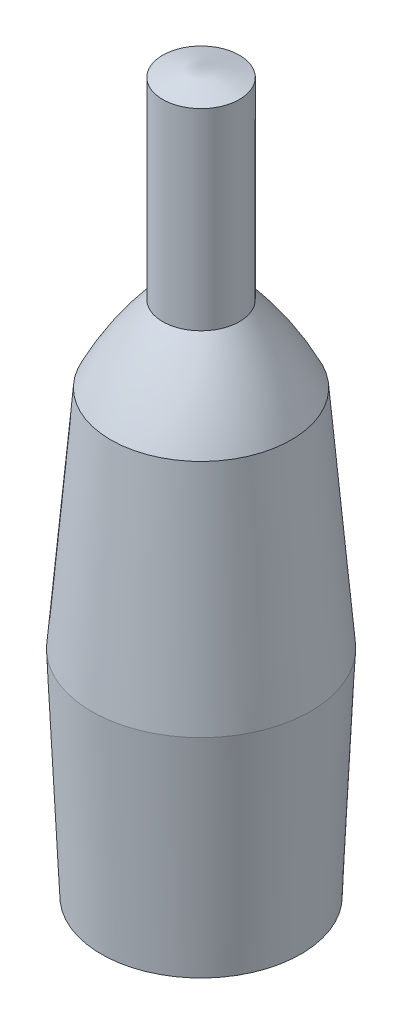
ISO-10303-21;
HEADER;
FILE_DESCRIPTION(('STEP AP214'),'2;1');
FILE_NAME('part.step','',(''),(''),'','','');
FILE_SCHEMA(('AUTOMOTIVE_DESIGN { 1 0 10303 214 1 1 1 1 }'));
ENDSEC;
DATA;
#1=APPLICATION_CONTEXT('core data for automotive mechanical design processes');
#2=APPLICATION_PROTOCOL_DEFINITION('international standard','automotive_design',2000,#1);
#3=PRODUCT_CONTEXT('',#1,'mechanical');
#4=PRODUCT('Part','Part','',(#3));
#5=PRODUCT_RELATED_PRODUCT_CATEGORY('part','',(#4));
#6=PRODUCT_DEFINITION_FORMATION('','',#4);
#7=PRODUCT_DEFINITION_CONTEXT('part definition',#1,'design');
#8=PRODUCT_DEFINITION('design','',#6,#7);
#9=PRODUCT_DEFINITION_SHAPE('','',#8);
#10=(LENGTH_UNIT() NAMED_UNIT(*) SI_UNIT(.MILLI.,.METRE.));
#11=(NAMED_UNIT(*) PLANE_ANGLE_UNIT() SI_UNIT($,.RADIAN.));
#12=(NAMED_UNIT(*) SI_UNIT($,.STERADIAN.) SOLID_ANGLE_UNIT());
#13=UNCERTAINTY_MEASURE_WITH_UNIT(LENGTH_MEASURE(1.E-05),#10,'distance_accuracy_value','');
#14=(GEOMETRIC_REPRESENTATION_CONTEXT(3) GLOBAL_UNCERTAINTY_ASSIGNED_CONTEXT((#13)) GLOBAL_UNIT_ASSIGNED_CONTEXT((#10,
#11,#12)) REPRESENTATION_CONTEXT('',''));
#15=CARTESIAN_POINT('',(0.,0.,0.));
#16=DIRECTION('',(0.,0.,1.));
#17=DIRECTION('',(1.,0.,0.));
#18=AXIS2_PLACEMENT_3D('',#15,#16,#17);
#19=CARTESIAN_POINT('',(0.,285.,0.));
#20=DIRECTION('',(0.,-1.,0.));
#21=DIRECTION('',(0.,0.,-1.));
#22=AXIS2_PLACEMENT_3D('',#19,#20,#21);
#23=CONICAL_SURFACE('',#22,0.,1.29565105235733);
#24=CARTESIAN_POINT('',(0.,280.713521285346,0.));
#25=DIRECTION('',(0.,-1.,0.));
#26=DIRECTION('',(0.,0.,-1.));
#27=AXIS2_PLACEMENT_3D('',#24,#25,#26);
#28=CIRCLE('',#27,15.1838320638246);
#29=CARTESIAN_POINT('',(0.,280.713521285346,-15.1838320638246));
#30=VERTEX_POINT('',#29);
#31=EDGE_CURVE('E11',#30,#30,#28,.T.);
#32=ORIENTED_EDGE('',*,*,#31,.F.);
#33=EDGE_LOOP('',(#32));
#34=FACE_BOUND('',#33,.T.);
#35=CARTESIAN_POINT('',(0.,285.,0.));
#36=VERTEX_POINT('',#35);
#37=VERTEX_LOOP('',#36);
#38=FACE_BOUND('',#37,.T.);
#39=ADVANCED_FACE('F45',(#34,#38),#23,.T.);
#40=CARTESIAN_POINT('',(0.,0.,0.));
#41=DIRECTION('',(0.,-1.,0.));
#42=DIRECTION('',(0.,0.,-1.));
#43=AXIS2_PLACEMENT_3D('',#40,#41,#42);
#44=CYLINDRICAL_SURFACE('',#43,15.1838320638246);
#45=CARTESIAN_POINT('',(0.,204.573878901025,0.));
#46=DIRECTION('',(0.,-1.,0.));
#47=DIRECTION('',(0.,0.,-1.));
#48=AXIS2_PLACEMENT_3D('',#45,#46,#47);
#49=CIRCLE('',#48,15.1838320638246);
#50=CARTESIAN_POINT('',(0.,204.573878901025,-15.1838320638246));
#51=VERTEX_POINT('',#50);
#52=EDGE_CURVE('E52',#51,#51,#49,.T.);
#53=ORIENTED_EDGE('',*,*,#52,.F.);
#54=EDGE_LOOP('',(#53));
#55=FACE_BOUND('',#54,.T.);
#56=ORIENTED_EDGE('',*,*,#31,.T.);
#57=EDGE_LOOP('',(#56));
#58=FACE_BOUND('',#57,.T.);
#59=ADVANCED_FACE('F56',(#55,#58),#44,.T.);
#60=CARTESIAN_POINT('',(0.,117.308224514586,0.));
#61=DIRECTION('',(0.,-1.,0.));
#62=DIRECTION('',(0.,0.,-1.));
#63=AXIS2_PLACEMENT_3D('',#60,#61,#62);
#64=DEGENERATE_TOROIDAL_SURFACE('',#63,80.7756761800128,129.705518995502,.F.);
#65=CARTESIAN_POINT('',(0.,174.328625731884,0.));
#66=DIRECTION('',(0.,-1.,0.));
#67=DIRECTION('',(0.,0.,-1.));
#68=AXIS2_PLACEMENT_3D('',#65,#66,#67);
#69=CIRCLE('',#68,35.7240899266659);
#70=CARTESIAN_POINT('',(0.,174.328625731884,-35.7240899266659));
#71=VERTEX_POINT('',#70);
#72=EDGE_CURVE('E93',#71,#71,#69,.T.);
#73=ORIENTED_EDGE('',*,*,#72,.F.);
#74=EDGE_LOOP('',(#73));
#75=FACE_BOUND('',#74,.T.);
#76=ORIENTED_EDGE('',*,*,#52,.T.);
#77=EDGE_LOOP('',(#76));
#78=FACE_BOUND('',#77,.T.);
#79=ADVANCED_FACE('F61',(#75,#78),#64,.F.);
#80=CARTESIAN_POINT('',(0.,174.328625731884,0.));
#81=DIRECTION('',(0.,-1.,0.));
#82=DIRECTION('',(0.,0.,-1.));
#83=AXIS2_PLACEMENT_3D('',#80,#81,#82);
#84=CONICAL_SURFACE('',#83,35.7240899266659,0.0843490983900789);
#85=CARTESIAN_POINT('',(0.,85.0436547911116,0.));
#86=DIRECTION('',(0.,-1.,0.));
#87=DIRECTION('',(0.,0.,-1.));
#88=AXIS2_PLACEMENT_3D('',#85,#86,#87);
#89=CIRCLE('',#88,43.2731084005896);
#90=CARTESIAN_POINT('',(0.,85.0436547911116,-43.2731084005896));
#91=VERTEX_POINT('',#90);
#92=EDGE_CURVE('E89',#91,#91,#89,.T.);
#93=ORIENTED_EDGE('',*,*,#92,.F.);
#94=EDGE_LOOP('',(#93));
#95=FACE_BOUND('',#94,.T.);
#96=ORIENTED_EDGE('',*,*,#72,.T.);
#97=EDGE_LOOP('',(#96));
#98=FACE_BOUND('',#97,.T.);
#99=ADVANCED_FACE('F68',(#95,#98),#84,.T.);
#100=CARTESIAN_POINT('',(0.,85.0436547911116,0.));
#101=DIRECTION('',(0.,1.,0.));
#102=DIRECTION('',(0.,0.,1.));
#103=AXIS2_PLACEMENT_3D('',#100,#101,#102);
#104=CONICAL_SURFACE('',#103,43.2731084005896,0.0443540878262823);
#105=CARTESIAN_POINT('',(0.,0.,0.));
#106=DIRECTION('',(0.,-1.,0.));
#107=DIRECTION('',(0.,0.,-1.));
#108=AXIS2_PLACEMENT_3D('',#105,#106,#107);
#109=CIRCLE('',#108,39.4985991636277);
#110=CARTESIAN_POINT('',(0.,0.,-39.4985991636277));
#111=VERTEX_POINT('',#110);
#112=EDGE_CURVE('E87',#111,#111,#109,.T.);
#113=ORIENTED_EDGE('',*,*,#112,.F.);
#114=EDGE_LOOP('',(#113));
#115=FACE_BOUND('',#114,.T.);
#116=ORIENTED_EDGE('',*,*,#92,.T.);
#117=EDGE_LOOP('',(#116));
#118=FACE_BOUND('',#117,.T.);
#119=ADVANCED_FACE('F75',(#115,#118),#104,.T.);
#120=CARTESIAN_POINT('',(0.,0.,39.4985991636277));
#121=DIRECTION('',(0.,1.,0.));
#122=DIRECTION('',(0.,0.,1.));
#123=AXIS2_PLACEMENT_3D('',#120,#121,#122);
#124=PLANE('',#123);
#125=ORIENTED_EDGE('',*,*,#112,.T.);
#126=EDGE_LOOP('',(#125));
#127=FACE_BOUND('',#126,.T.);
#128=ADVANCED_FACE('F79',(#127),#124,.F.);
#129=CLOSED_SHELL('',(#39,#59,#79,#99,#119,#128));
#130=MANIFOLD_SOLID_BREP('B2',#129);
#131=ADVANCED_BREP_SHAPE_REPRESENTATION('',(#18,#130),#14);
#132=SHAPE_DEFINITION_REPRESENTATION(#9,#131);
ENDSEC;
END-ISO-10303-21;
